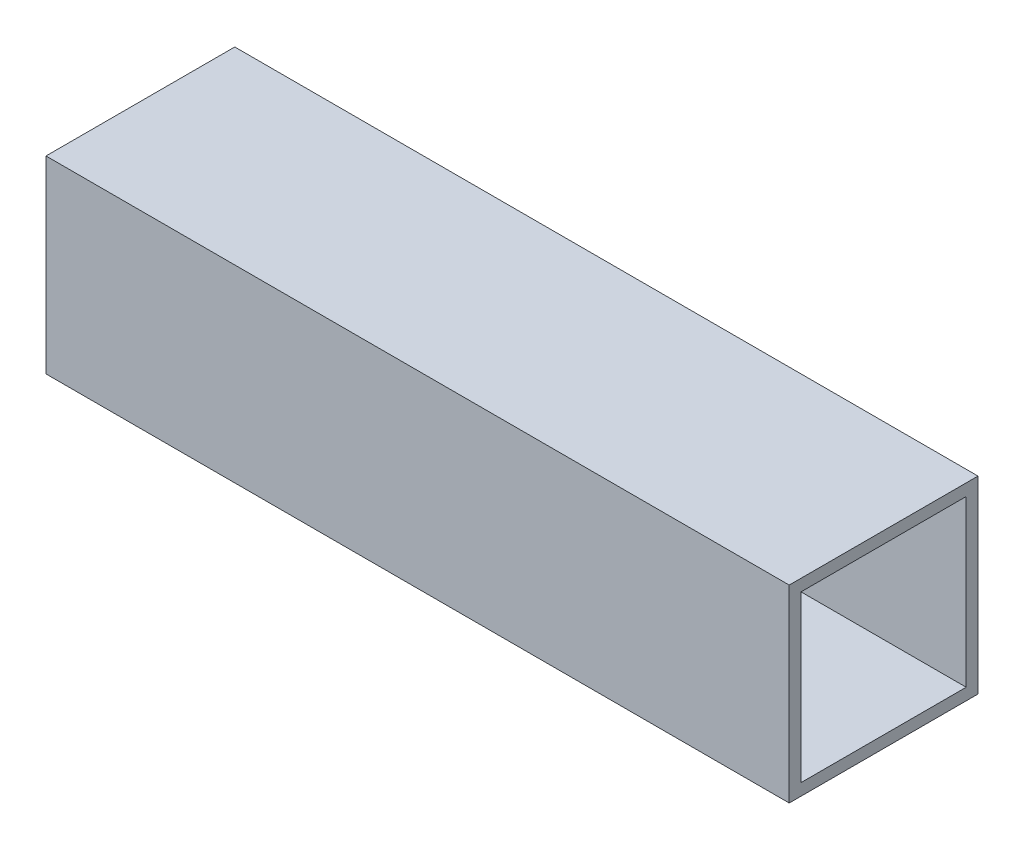
ISO-10303-21;
HEADER;
FILE_DESCRIPTION(('STEP AP214'),'2;1');
FILE_NAME('part.step','',(''),(''),'','','');
FILE_SCHEMA(('AUTOMOTIVE_DESIGN { 1 0 10303 214 1 1 1 1 }'));
ENDSEC;
DATA;
#1=APPLICATION_CONTEXT('core data for automotive mechanical design processes');
#2=APPLICATION_PROTOCOL_DEFINITION('international standard','automotive_design',2000,#1);
#3=PRODUCT_CONTEXT('',#1,'mechanical');
#4=PRODUCT('Part','Part','',(#3));
#5=PRODUCT_RELATED_PRODUCT_CATEGORY('part','',(#4));
#6=PRODUCT_DEFINITION_FORMATION('','',#4);
#7=PRODUCT_DEFINITION_CONTEXT('part definition',#1,'design');
#8=PRODUCT_DEFINITION('design','',#6,#7);
#9=PRODUCT_DEFINITION_SHAPE('','',#8);
#10=(LENGTH_UNIT() NAMED_UNIT(*) SI_UNIT(.MILLI.,.METRE.));
#11=(NAMED_UNIT(*) PLANE_ANGLE_UNIT() SI_UNIT($,.RADIAN.));
#12=(NAMED_UNIT(*) SI_UNIT($,.STERADIAN.) SOLID_ANGLE_UNIT());
#13=UNCERTAINTY_MEASURE_WITH_UNIT(LENGTH_MEASURE(1.E-05),#10,'distance_accuracy_value','');
#14=(GEOMETRIC_REPRESENTATION_CONTEXT(3) GLOBAL_UNCERTAINTY_ASSIGNED_CONTEXT((#13)) GLOBAL_UNIT_ASSIGNED_CONTEXT((#10,
#11,#12)) REPRESENTATION_CONTEXT('',''));
#15=CARTESIAN_POINT('',(0.,0.,0.));
#16=DIRECTION('',(0.,0.,1.));
#17=DIRECTION('',(1.,0.,0.));
#18=AXIS2_PLACEMENT_3D('',#15,#16,#17);
#19=CARTESIAN_POINT('',(100.,0.,0.));
#20=DIRECTION('',(-1.,0.,0.));
#21=DIRECTION('',(0.,0.,1.));
#22=AXIS2_PLACEMENT_3D('',#19,#20,#21);
#23=PLANE('',#22);
#24=DIRECTION('',(0.,-1.,0.));
#25=VECTOR('',#24,1.);
#26=CARTESIAN_POINT('',(100.,0.,0.));
#27=LINE('',#26,#25);
#28=CARTESIAN_POINT('',(100.,25.4,0.));
#29=VERTEX_POINT('',#28);
#30=CARTESIAN_POINT('',(100.,0.,0.));
#31=VERTEX_POINT('',#30);
#32=EDGE_CURVE('E133',#29,#31,#27,.T.);
#33=ORIENTED_EDGE('',*,*,#32,.T.);
#34=DIRECTION('',(0.,0.,-1.));
#35=VECTOR('',#34,1.);
#36=CARTESIAN_POINT('',(100.,0.,0.));
#37=LINE('',#36,#35);
#38=CARTESIAN_POINT('',(100.,0.,-25.4));
#39=VERTEX_POINT('',#38);
#40=EDGE_CURVE('E136',#31,#39,#37,.T.);
#41=ORIENTED_EDGE('',*,*,#40,.T.);
#42=DIRECTION('',(0.,1.,0.));
#43=VECTOR('',#42,1.);
#44=CARTESIAN_POINT('',(100.,0.,-25.4));
#45=LINE('',#44,#43);
#46=CARTESIAN_POINT('',(100.,25.4,-25.4));
#47=VERTEX_POINT('',#46);
#48=EDGE_CURVE('E139',#39,#47,#45,.T.);
#49=ORIENTED_EDGE('',*,*,#48,.T.);
#50=DIRECTION('',(0.,0.,1.));
#51=VECTOR('',#50,1.);
#52=CARTESIAN_POINT('',(100.,25.4,0.));
#53=LINE('',#52,#51);
#54=EDGE_CURVE('E141',#47,#29,#53,.T.);
#55=ORIENTED_EDGE('',*,*,#54,.T.);
#56=EDGE_LOOP('',(#33,#41,#49,#55));
#57=FACE_BOUND('',#56,.T.);
#58=DIRECTION('',(0.,-1.,0.));
#59=VECTOR('',#58,1.);
#60=CARTESIAN_POINT('',(100.,1.5875,-1.5875));
#61=LINE('',#60,#59);
#62=CARTESIAN_POINT('',(100.,23.8125,-1.5875));
#63=VERTEX_POINT('',#62);
#64=CARTESIAN_POINT('',(100.,1.5875,-1.5875));
#65=VERTEX_POINT('',#64);
#66=EDGE_CURVE('E97',#63,#65,#61,.T.);
#67=ORIENTED_EDGE('',*,*,#66,.F.);
#68=DIRECTION('',(0.,0.,1.));
#69=VECTOR('',#68,1.);
#70=CARTESIAN_POINT('',(100.,23.8125,-1.5875));
#71=LINE('',#70,#69);
#72=CARTESIAN_POINT('',(100.,23.8125,-23.8125));
#73=VERTEX_POINT('',#72);
#74=EDGE_CURVE('E119',#73,#63,#71,.T.);
#75=ORIENTED_EDGE('',*,*,#74,.F.);
#76=DIRECTION('',(0.,1.,0.));
#77=VECTOR('',#76,1.);
#78=CARTESIAN_POINT('',(100.,1.5875,-23.8125));
#79=LINE('',#78,#77);
#80=CARTESIAN_POINT('',(100.,1.5875,-23.8125));
#81=VERTEX_POINT('',#80);
#82=EDGE_CURVE('E117',#81,#73,#79,.T.);
#83=ORIENTED_EDGE('',*,*,#82,.F.);
#84=DIRECTION('',(0.,0.,-1.));
#85=VECTOR('',#84,1.);
#86=CARTESIAN_POINT('',(100.,1.5875,-1.5875));
#87=LINE('',#86,#85);
#88=EDGE_CURVE('E105',#65,#81,#87,.T.);
#89=ORIENTED_EDGE('',*,*,#88,.F.);
#90=EDGE_LOOP('',(#67,#75,#83,#89));
#91=FACE_BOUND('',#90,.T.);
#92=ADVANCED_FACE('F32',(#57,#91),#23,.F.);
#93=CARTESIAN_POINT('',(0.,0.,0.));
#94=DIRECTION('',(-1.,0.,0.));
#95=DIRECTION('',(0.,0.,1.));
#96=AXIS2_PLACEMENT_3D('',#93,#94,#95);
#97=PLANE('',#96);
#98=DIRECTION('',(0.,-1.,0.));
#99=VECTOR('',#98,1.);
#100=CARTESIAN_POINT('',(0.,0.,0.));
#101=LINE('',#100,#99);
#102=CARTESIAN_POINT('',(0.,25.4,0.));
#103=VERTEX_POINT('',#102);
#104=CARTESIAN_POINT('',(0.,0.,0.));
#105=VERTEX_POINT('',#104);
#106=EDGE_CURVE('E113',#103,#105,#101,.T.);
#107=ORIENTED_EDGE('',*,*,#106,.F.);
#108=DIRECTION('',(0.,0.,1.));
#109=VECTOR('',#108,1.);
#110=CARTESIAN_POINT('',(0.,25.4,0.));
#111=LINE('',#110,#109);
#112=CARTESIAN_POINT('',(0.,25.4,-25.4));
#113=VERTEX_POINT('',#112);
#114=EDGE_CURVE('E137',#113,#103,#111,.T.);
#115=ORIENTED_EDGE('',*,*,#114,.F.);
#116=DIRECTION('',(0.,1.,0.));
#117=VECTOR('',#116,1.);
#118=CARTESIAN_POINT('',(0.,0.,-25.4));
#119=LINE('',#118,#117);
#120=CARTESIAN_POINT('',(0.,0.,-25.4));
#121=VERTEX_POINT('',#120);
#122=EDGE_CURVE('E148',#121,#113,#119,.T.);
#123=ORIENTED_EDGE('',*,*,#122,.F.);
#124=DIRECTION('',(0.,0.,-1.));
#125=VECTOR('',#124,1.);
#126=CARTESIAN_POINT('',(0.,0.,0.));
#127=LINE('',#126,#125);
#128=EDGE_CURVE('E146',#105,#121,#127,.T.);
#129=ORIENTED_EDGE('',*,*,#128,.F.);
#130=EDGE_LOOP('',(#107,#115,#123,#129));
#131=FACE_BOUND('',#130,.T.);
#132=DIRECTION('',(0.,0.,1.));
#133=VECTOR('',#132,1.);
#134=CARTESIAN_POINT('',(0.,23.8125,-1.5875));
#135=LINE('',#134,#133);
#136=CARTESIAN_POINT('',(0.,23.8125,-23.8125));
#137=VERTEX_POINT('',#136);
#138=CARTESIAN_POINT('',(0.,23.8125,-1.5875));
#139=VERTEX_POINT('',#138);
#140=EDGE_CURVE('E106',#137,#139,#135,.T.);
#141=ORIENTED_EDGE('',*,*,#140,.T.);
#142=DIRECTION('',(0.,-1.,0.));
#143=VECTOR('',#142,1.);
#144=CARTESIAN_POINT('',(0.,1.5875,-1.5875));
#145=LINE('',#144,#143);
#146=CARTESIAN_POINT('',(0.,1.5875,-1.5875));
#147=VERTEX_POINT('',#146);
#148=EDGE_CURVE('E55',#139,#147,#145,.T.);
#149=ORIENTED_EDGE('',*,*,#148,.T.);
#150=DIRECTION('',(0.,0.,-1.));
#151=VECTOR('',#150,1.);
#152=CARTESIAN_POINT('',(0.,1.5875,-1.5875));
#153=LINE('',#152,#151);
#154=CARTESIAN_POINT('',(0.,1.5875,-23.8125));
#155=VERTEX_POINT('',#154);
#156=EDGE_CURVE('E112',#147,#155,#153,.T.);
#157=ORIENTED_EDGE('',*,*,#156,.T.);
#158=DIRECTION('',(0.,1.,0.));
#159=VECTOR('',#158,1.);
#160=CARTESIAN_POINT('',(0.,1.5875,-23.8125));
#161=LINE('',#160,#159);
#162=EDGE_CURVE('E125',#155,#137,#161,.T.);
#163=ORIENTED_EDGE('',*,*,#162,.T.);
#164=EDGE_LOOP('',(#141,#149,#157,#163));
#165=FACE_BOUND('',#164,.T.);
#166=ADVANCED_FACE('F166',(#131,#165),#97,.T.);
#167=CARTESIAN_POINT('',(100.,0.,0.));
#168=DIRECTION('',(0.,0.,-1.));
#169=DIRECTION('',(-1.,0.,0.));
#170=AXIS2_PLACEMENT_3D('',#167,#168,#169);
#171=PLANE('',#170);
#172=ORIENTED_EDGE('',*,*,#106,.T.);
#173=DIRECTION('',(-1.,0.,0.));
#174=VECTOR('',#173,1.);
#175=CARTESIAN_POINT('',(100.,0.,0.));
#176=LINE('',#175,#174);
#177=EDGE_CURVE('E11',#31,#105,#176,.T.);
#178=ORIENTED_EDGE('',*,*,#177,.F.);
#179=ORIENTED_EDGE('',*,*,#32,.F.);
#180=DIRECTION('',(-1.,0.,0.));
#181=VECTOR('',#180,1.);
#182=CARTESIAN_POINT('',(100.,25.4,0.));
#183=LINE('',#182,#181);
#184=EDGE_CURVE('E143',#29,#103,#183,.T.);
#185=ORIENTED_EDGE('',*,*,#184,.T.);
#186=EDGE_LOOP('',(#172,#178,#179,#185));
#187=FACE_BOUND('',#186,.T.);
#188=ADVANCED_FACE('F34',(#187),#171,.F.);
#189=CARTESIAN_POINT('',(100.,0.,0.));
#190=DIRECTION('',(0.,1.,0.));
#191=DIRECTION('',(0.,0.,1.));
#192=AXIS2_PLACEMENT_3D('',#189,#190,#191);
#193=PLANE('',#192);
#194=ORIENTED_EDGE('',*,*,#128,.T.);
#195=DIRECTION('',(-1.,0.,0.));
#196=VECTOR('',#195,1.);
#197=CARTESIAN_POINT('',(100.,0.,-25.4));
#198=LINE('',#197,#196);
#199=EDGE_CURVE('E40',#39,#121,#198,.T.);
#200=ORIENTED_EDGE('',*,*,#199,.F.);
#201=ORIENTED_EDGE('',*,*,#40,.F.);
#202=ORIENTED_EDGE('',*,*,#177,.T.);
#203=EDGE_LOOP('',(#194,#200,#201,#202));
#204=FACE_BOUND('',#203,.T.);
#205=ADVANCED_FACE('F176',(#204),#193,.F.);
#206=CARTESIAN_POINT('',(100.,0.,-25.4));
#207=DIRECTION('',(0.,0.,1.));
#208=DIRECTION('',(1.,0.,0.));
#209=AXIS2_PLACEMENT_3D('',#206,#207,#208);
#210=PLANE('',#209);
#211=ORIENTED_EDGE('',*,*,#122,.T.);
#212=DIRECTION('',(-1.,0.,0.));
#213=VECTOR('',#212,1.);
#214=CARTESIAN_POINT('',(100.,25.4,-25.4));
#215=LINE('',#214,#213);
#216=EDGE_CURVE('E153',#47,#113,#215,.T.);
#217=ORIENTED_EDGE('',*,*,#216,.F.);
#218=ORIENTED_EDGE('',*,*,#48,.F.);
#219=ORIENTED_EDGE('',*,*,#199,.T.);
#220=EDGE_LOOP('',(#211,#217,#218,#219));
#221=FACE_BOUND('',#220,.T.);
#222=ADVANCED_FACE('F160',(#221),#210,.F.);
#223=CARTESIAN_POINT('',(100.,25.4,0.));
#224=DIRECTION('',(0.,-1.,0.));
#225=DIRECTION('',(0.,0.,-1.));
#226=AXIS2_PLACEMENT_3D('',#223,#224,#225);
#227=PLANE('',#226);
#228=ORIENTED_EDGE('',*,*,#114,.T.);
#229=ORIENTED_EDGE('',*,*,#184,.F.);
#230=ORIENTED_EDGE('',*,*,#54,.F.);
#231=ORIENTED_EDGE('',*,*,#216,.T.);
#232=EDGE_LOOP('',(#228,#229,#230,#231));
#233=FACE_BOUND('',#232,.T.);
#234=ADVANCED_FACE('F170',(#233),#227,.F.);
#235=CARTESIAN_POINT('',(100.,1.5875,-1.5875));
#236=DIRECTION('',(0.,0.,-1.));
#237=DIRECTION('',(-1.,0.,0.));
#238=AXIS2_PLACEMENT_3D('',#235,#236,#237);
#239=PLANE('',#238);
#240=ORIENTED_EDGE('',*,*,#148,.F.);
#241=DIRECTION('',(-1.,0.,0.));
#242=VECTOR('',#241,1.);
#243=CARTESIAN_POINT('',(100.,23.8125,-1.5875));
#244=LINE('',#243,#242);
#245=EDGE_CURVE('E101',#63,#139,#244,.T.);
#246=ORIENTED_EDGE('',*,*,#245,.F.);
#247=ORIENTED_EDGE('',*,*,#66,.T.);
#248=DIRECTION('',(-1.,0.,0.));
#249=VECTOR('',#248,1.);
#250=CARTESIAN_POINT('',(100.,1.5875,-1.5875));
#251=LINE('',#250,#249);
#252=EDGE_CURVE('E100',#65,#147,#251,.T.);
#253=ORIENTED_EDGE('',*,*,#252,.T.);
#254=EDGE_LOOP('',(#240,#246,#247,#253));
#255=FACE_BOUND('',#254,.T.);
#256=ADVANCED_FACE('F99',(#255),#239,.T.);
#257=CARTESIAN_POINT('',(100.,1.5875,-1.5875));
#258=DIRECTION('',(0.,1.,0.));
#259=DIRECTION('',(0.,0.,1.));
#260=AXIS2_PLACEMENT_3D('',#257,#258,#259);
#261=PLANE('',#260);
#262=ORIENTED_EDGE('',*,*,#156,.F.);
#263=ORIENTED_EDGE('',*,*,#252,.F.);
#264=ORIENTED_EDGE('',*,*,#88,.T.);
#265=DIRECTION('',(-1.,0.,0.));
#266=VECTOR('',#265,1.);
#267=CARTESIAN_POINT('',(100.,1.5875,-23.8125));
#268=LINE('',#267,#266);
#269=EDGE_CURVE('E114',#81,#155,#268,.T.);
#270=ORIENTED_EDGE('',*,*,#269,.T.);
#271=EDGE_LOOP('',(#262,#263,#264,#270));
#272=FACE_BOUND('',#271,.T.);
#273=ADVANCED_FACE('F109',(#272),#261,.T.);
#274=CARTESIAN_POINT('',(100.,1.5875,-23.8125));
#275=DIRECTION('',(0.,0.,1.));
#276=DIRECTION('',(1.,0.,0.));
#277=AXIS2_PLACEMENT_3D('',#274,#275,#276);
#278=PLANE('',#277);
#279=ORIENTED_EDGE('',*,*,#162,.F.);
#280=ORIENTED_EDGE('',*,*,#269,.F.);
#281=ORIENTED_EDGE('',*,*,#82,.T.);
#282=DIRECTION('',(-1.,0.,0.));
#283=VECTOR('',#282,1.);
#284=CARTESIAN_POINT('',(100.,23.8125,-23.8125));
#285=LINE('',#284,#283);
#286=EDGE_CURVE('E47',#73,#137,#285,.T.);
#287=ORIENTED_EDGE('',*,*,#286,.T.);
#288=EDGE_LOOP('',(#279,#280,#281,#287));
#289=FACE_BOUND('',#288,.T.);
#290=ADVANCED_FACE('F199',(#289),#278,.T.);
#291=CARTESIAN_POINT('',(100.,23.8125,-1.5875));
#292=DIRECTION('',(0.,-1.,0.));
#293=DIRECTION('',(0.,0.,-1.));
#294=AXIS2_PLACEMENT_3D('',#291,#292,#293);
#295=PLANE('',#294);
#296=ORIENTED_EDGE('',*,*,#140,.F.);
#297=ORIENTED_EDGE('',*,*,#286,.F.);
#298=ORIENTED_EDGE('',*,*,#74,.T.);
#299=ORIENTED_EDGE('',*,*,#245,.T.);
#300=EDGE_LOOP('',(#296,#297,#298,#299));
#301=FACE_BOUND('',#300,.T.);
#302=ADVANCED_FACE('F203',(#301),#295,.T.);
#303=CLOSED_SHELL('',(#92,#166,#188,#205,#222,#234,#256,#273,#290,#302));
#304=MANIFOLD_SOLID_BREP('B2',#303);
#305=ADVANCED_BREP_SHAPE_REPRESENTATION('',(#18,#304),#14);
#306=SHAPE_DEFINITION_REPRESENTATION(#9,#305);
ENDSEC;
END-ISO-10303-21;
